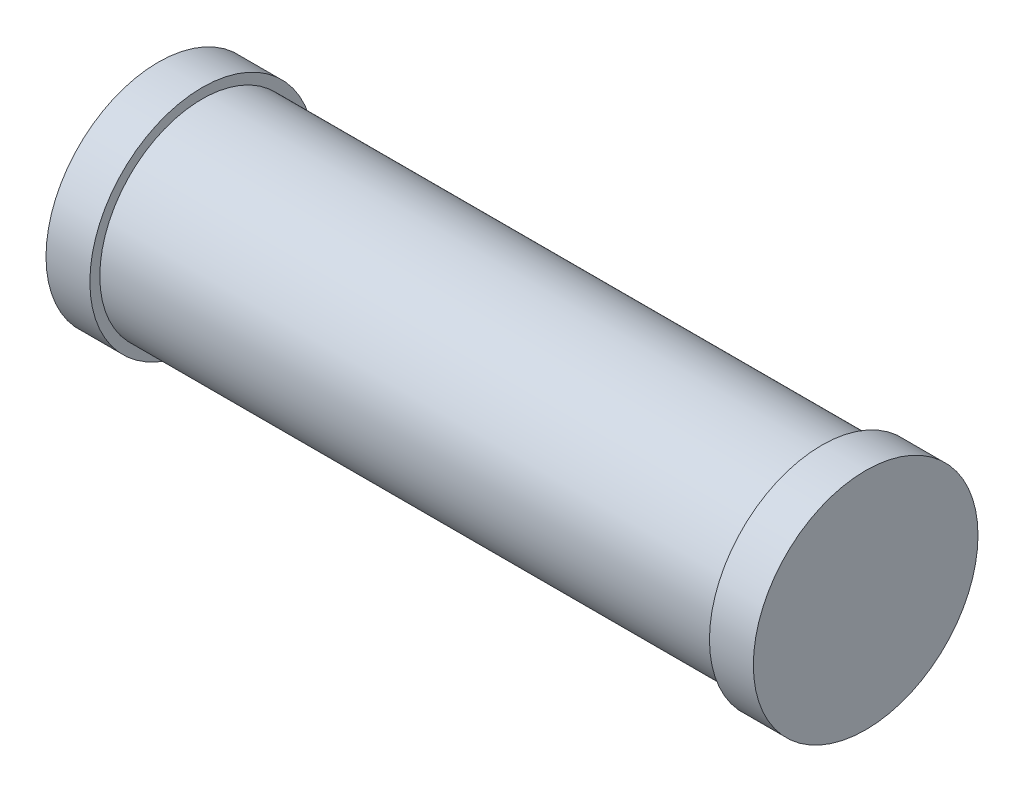
ISO-10303-21;
HEADER;
FILE_DESCRIPTION(('STEP AP214'),'2;1');
FILE_NAME('part.step','',(''),(''),'','','');
FILE_SCHEMA(('AUTOMOTIVE_DESIGN { 1 0 10303 214 1 1 1 1 }'));
ENDSEC;
DATA;
#1=APPLICATION_CONTEXT('core data for automotive mechanical design processes');
#2=APPLICATION_PROTOCOL_DEFINITION('international standard','automotive_design',2000,#1);
#3=PRODUCT_CONTEXT('',#1,'mechanical');
#4=PRODUCT('Part','Part','',(#3));
#5=PRODUCT_RELATED_PRODUCT_CATEGORY('part','',(#4));
#6=PRODUCT_DEFINITION_FORMATION('','',#4);
#7=PRODUCT_DEFINITION_CONTEXT('part definition',#1,'design');
#8=PRODUCT_DEFINITION('design','',#6,#7);
#9=PRODUCT_DEFINITION_SHAPE('','',#8);
#10=(LENGTH_UNIT() NAMED_UNIT(*) SI_UNIT(.MILLI.,.METRE.));
#11=(NAMED_UNIT(*) PLANE_ANGLE_UNIT() SI_UNIT($,.RADIAN.));
#12=(NAMED_UNIT(*) SI_UNIT($,.STERADIAN.) SOLID_ANGLE_UNIT());
#13=UNCERTAINTY_MEASURE_WITH_UNIT(LENGTH_MEASURE(1.E-05),#10,'distance_accuracy_value','');
#14=(GEOMETRIC_REPRESENTATION_CONTEXT(3) GLOBAL_UNCERTAINTY_ASSIGNED_CONTEXT((#13)) GLOBAL_UNIT_ASSIGNED_CONTEXT((#10,
#11,#12)) REPRESENTATION_CONTEXT('',''));
#15=CARTESIAN_POINT('',(0.,0.,0.));
#16=DIRECTION('',(0.,0.,1.));
#17=DIRECTION('',(1.,0.,0.));
#18=AXIS2_PLACEMENT_3D('',#15,#16,#17);
#19=CARTESIAN_POINT('',(17.65,0.,-5.83499999999999));
#20=DIRECTION('',(-1.,0.,0.));
#21=DIRECTION('',(0.,0.,1.));
#22=AXIS2_PLACEMENT_3D('',#19,#20,#21);
#23=PLANE('',#22);
#24=CARTESIAN_POINT('',(17.65,0.,0.));
#25=DIRECTION('',(1.,0.,0.));
#26=DIRECTION('',(0.,0.,-1.));
#27=AXIS2_PLACEMENT_3D('',#24,#25,#26);
#28=CIRCLE('',#27,5.835);
#29=CARTESIAN_POINT('',(17.65,0.,-5.83499999999999));
#30=VERTEX_POINT('',#29);
#31=EDGE_CURVE('E53',#30,#30,#28,.T.);
#32=ORIENTED_EDGE('',*,*,#31,.T.);
#33=EDGE_LOOP('',(#32));
#34=FACE_BOUND('',#33,.T.);
#35=CARTESIAN_POINT('',(17.65,0.,0.));
#36=DIRECTION('',(1.,0.,0.));
#37=DIRECTION('',(0.,0.,-1.));
#38=AXIS2_PLACEMENT_3D('',#35,#36,#37);
#39=CIRCLE('',#38,6.4);
#40=CARTESIAN_POINT('',(17.65,0.,-6.39999999999999));
#41=VERTEX_POINT('',#40);
#42=EDGE_CURVE('E10',#41,#41,#39,.T.);
#43=ORIENTED_EDGE('',*,*,#42,.F.);
#44=EDGE_LOOP('',(#43));
#45=FACE_BOUND('',#44,.T.);
#46=ADVANCED_FACE('F31',(#34,#45),#23,.T.);
#47=CARTESIAN_POINT('',(20.15,0.,0.));
#48=DIRECTION('',(1.,0.,0.));
#49=DIRECTION('',(0.,0.,-1.));
#50=AXIS2_PLACEMENT_3D('',#47,#48,#49);
#51=CYLINDRICAL_SURFACE('',#50,6.4);
#52=ORIENTED_EDGE('',*,*,#42,.T.);
#53=EDGE_LOOP('',(#52));
#54=FACE_BOUND('',#53,.T.);
#55=CARTESIAN_POINT('',(20.15,0.,0.));
#56=DIRECTION('',(1.,0.,0.));
#57=DIRECTION('',(0.,0.,-1.));
#58=AXIS2_PLACEMENT_3D('',#55,#56,#57);
#59=CIRCLE('',#58,6.4);
#60=CARTESIAN_POINT('',(20.15,0.,-6.39999999999999));
#61=VERTEX_POINT('',#60);
#62=EDGE_CURVE('E37',#61,#61,#59,.T.);
#63=ORIENTED_EDGE('',*,*,#62,.F.);
#64=EDGE_LOOP('',(#63));
#65=FACE_BOUND('',#64,.T.);
#66=ADVANCED_FACE('F71',(#54,#65),#51,.T.);
#67=CARTESIAN_POINT('',(20.15,0.,-6.39999999999999));
#68=DIRECTION('',(1.,0.,0.));
#69=DIRECTION('',(0.,0.,-1.));
#70=AXIS2_PLACEMENT_3D('',#67,#68,#69);
#71=PLANE('',#70);
#72=ORIENTED_EDGE('',*,*,#62,.T.);
#73=EDGE_LOOP('',(#72));
#74=FACE_BOUND('',#73,.T.);
#75=ADVANCED_FACE('F75',(#74),#71,.T.);
#76=CARTESIAN_POINT('',(-20.15,0.,-6.39999999999999));
#77=DIRECTION('',(-1.,0.,0.));
#78=DIRECTION('',(0.,0.,1.));
#79=AXIS2_PLACEMENT_3D('',#76,#77,#78);
#80=PLANE('',#79);
#81=CARTESIAN_POINT('',(-20.15,0.,0.));
#82=DIRECTION('',(1.,0.,0.));
#83=DIRECTION('',(0.,0.,-1.));
#84=AXIS2_PLACEMENT_3D('',#81,#82,#83);
#85=CIRCLE('',#84,6.4);
#86=CARTESIAN_POINT('',(-20.15,0.,-6.39999999999999));
#87=VERTEX_POINT('',#86);
#88=EDGE_CURVE('E41',#87,#87,#85,.T.);
#89=ORIENTED_EDGE('',*,*,#88,.F.);
#90=EDGE_LOOP('',(#89));
#91=FACE_BOUND('',#90,.T.);
#92=ADVANCED_FACE('F79',(#91),#80,.T.);
#93=CARTESIAN_POINT('',(20.15,0.,0.));
#94=DIRECTION('',(1.,0.,0.));
#95=DIRECTION('',(0.,0.,-1.));
#96=AXIS2_PLACEMENT_3D('',#93,#94,#95);
#97=CYLINDRICAL_SURFACE('',#96,6.4);
#98=ORIENTED_EDGE('',*,*,#88,.T.);
#99=EDGE_LOOP('',(#98));
#100=FACE_BOUND('',#99,.T.);
#101=CARTESIAN_POINT('',(-17.65,0.,0.));
#102=DIRECTION('',(1.,0.,0.));
#103=DIRECTION('',(0.,0.,-1.));
#104=AXIS2_PLACEMENT_3D('',#101,#102,#103);
#105=CIRCLE('',#104,6.4);
#106=CARTESIAN_POINT('',(-17.65,0.,-6.39999999999999));
#107=VERTEX_POINT('',#106);
#108=EDGE_CURVE('E45',#107,#107,#105,.T.);
#109=ORIENTED_EDGE('',*,*,#108,.F.);
#110=EDGE_LOOP('',(#109));
#111=FACE_BOUND('',#110,.T.);
#112=ADVANCED_FACE('F67',(#100,#111),#97,.T.);
#113=CARTESIAN_POINT('',(-17.65,0.,-5.83499999999999));
#114=DIRECTION('',(1.,0.,0.));
#115=DIRECTION('',(0.,0.,-1.));
#116=AXIS2_PLACEMENT_3D('',#113,#114,#115);
#117=PLANE('',#116);
#118=ORIENTED_EDGE('',*,*,#108,.T.);
#119=EDGE_LOOP('',(#118));
#120=FACE_BOUND('',#119,.T.);
#121=CARTESIAN_POINT('',(-17.65,0.,0.));
#122=DIRECTION('',(1.,0.,0.));
#123=DIRECTION('',(0.,0.,-1.));
#124=AXIS2_PLACEMENT_3D('',#121,#122,#123);
#125=CIRCLE('',#124,5.835);
#126=CARTESIAN_POINT('',(-17.65,0.,-5.83499999999999));
#127=VERTEX_POINT('',#126);
#128=EDGE_CURVE('E50',#127,#127,#125,.T.);
#129=ORIENTED_EDGE('',*,*,#128,.F.);
#130=EDGE_LOOP('',(#129));
#131=FACE_BOUND('',#130,.T.);
#132=ADVANCED_FACE('F61',(#120,#131),#117,.T.);
#133=CARTESIAN_POINT('',(20.15,0.,0.));
#134=DIRECTION('',(1.,0.,0.));
#135=DIRECTION('',(0.,0.,-1.));
#136=AXIS2_PLACEMENT_3D('',#133,#134,#135);
#137=CYLINDRICAL_SURFACE('',#136,5.835);
#138=ORIENTED_EDGE('',*,*,#128,.T.);
#139=EDGE_LOOP('',(#138));
#140=FACE_BOUND('',#139,.T.);
#141=ORIENTED_EDGE('',*,*,#31,.F.);
#142=EDGE_LOOP('',(#141));
#143=FACE_BOUND('',#142,.T.);
#144=ADVANCED_FACE('F59',(#140,#143),#137,.T.);
#145=CLOSED_SHELL('',(#46,#66,#75,#92,#112,#132,#144));
#146=MANIFOLD_SOLID_BREP('B2',#145);
#147=ADVANCED_BREP_SHAPE_REPRESENTATION('',(#18,#146),#14);
#148=SHAPE_DEFINITION_REPRESENTATION(#9,#147);
ENDSEC;
END-ISO-10303-21;
